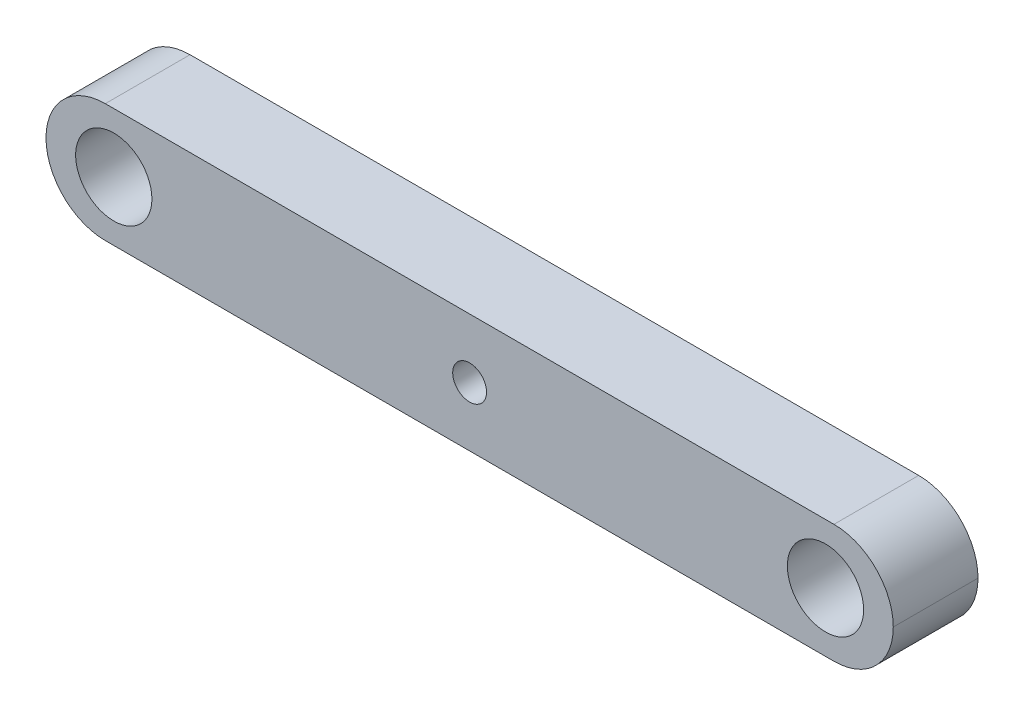
ISO-10303-21;
HEADER;
FILE_DESCRIPTION(('STEP AP214'),'2;1');
FILE_NAME('part.step','',(''),(''),'','','');
FILE_SCHEMA(('AUTOMOTIVE_DESIGN { 1 0 10303 214 1 1 1 1 }'));
ENDSEC;
DATA;
#1=APPLICATION_CONTEXT('core data for automotive mechanical design processes');
#2=APPLICATION_PROTOCOL_DEFINITION('international standard','automotive_design',2000,#1);
#3=PRODUCT_CONTEXT('',#1,'mechanical');
#4=PRODUCT('Part','Part','',(#3));
#5=PRODUCT_RELATED_PRODUCT_CATEGORY('part','',(#4));
#6=PRODUCT_DEFINITION_FORMATION('','',#4);
#7=PRODUCT_DEFINITION_CONTEXT('part definition',#1,'design');
#8=PRODUCT_DEFINITION('design','',#6,#7);
#9=PRODUCT_DEFINITION_SHAPE('','',#8);
#10=(LENGTH_UNIT() NAMED_UNIT(*) SI_UNIT(.MILLI.,.METRE.));
#11=(NAMED_UNIT(*) PLANE_ANGLE_UNIT() SI_UNIT($,.RADIAN.));
#12=(NAMED_UNIT(*) SI_UNIT($,.STERADIAN.) SOLID_ANGLE_UNIT());
#13=UNCERTAINTY_MEASURE_WITH_UNIT(LENGTH_MEASURE(1.E-05),#10,'distance_accuracy_value','');
#14=(GEOMETRIC_REPRESENTATION_CONTEXT(3) GLOBAL_UNCERTAINTY_ASSIGNED_CONTEXT((#13)) GLOBAL_UNIT_ASSIGNED_CONTEXT((#10,
#11,#12)) REPRESENTATION_CONTEXT('',''));
#15=CARTESIAN_POINT('',(0.,0.,0.));
#16=DIRECTION('',(0.,0.,1.));
#17=DIRECTION('',(1.,0.,0.));
#18=AXIS2_PLACEMENT_3D('',#15,#16,#17);
#19=CARTESIAN_POINT('',(0.,0.,5.));
#20=DIRECTION('',(0.,0.,-1.));
#21=DIRECTION('',(-1.,0.,0.));
#22=AXIS2_PLACEMENT_3D('',#19,#20,#21);
#23=PLANE('',#22);
#24=DIRECTION('',(1.,0.,0.));
#25=VECTOR('',#24,1.);
#26=CARTESIAN_POINT('',(0.,0.,5.));
#27=LINE('',#26,#25);
#28=CARTESIAN_POINT('',(3.5,0.,5.));
#29=VERTEX_POINT('',#28);
#30=CARTESIAN_POINT('',(46.5,0.,5.));
#31=VERTEX_POINT('',#30);
#32=EDGE_CURVE('E157',#29,#31,#27,.T.);
#33=ORIENTED_EDGE('',*,*,#32,.T.);
#34=CARTESIAN_POINT('',(46.5,3.5,5.));
#35=DIRECTION('',(0.,0.,-1.));
#36=DIRECTION('',(-1.,0.,0.));
#37=AXIS2_PLACEMENT_3D('',#34,#35,#36);
#38=CIRCLE('',#37,3.5);
#39=CARTESIAN_POINT('',(50.,3.5,5.));
#40=VERTEX_POINT('',#39);
#41=EDGE_CURVE('E132',#31,#40,#38,.F.);
#42=ORIENTED_EDGE('',*,*,#41,.T.);
#43=CARTESIAN_POINT('',(46.5,3.5,5.));
#44=DIRECTION('',(0.,0.,-1.));
#45=DIRECTION('',(-1.,0.,0.));
#46=AXIS2_PLACEMENT_3D('',#43,#44,#45);
#47=CIRCLE('',#46,3.5);
#48=CARTESIAN_POINT('',(46.5,7.,5.));
#49=VERTEX_POINT('',#48);
#50=EDGE_CURVE('E63',#40,#49,#47,.F.);
#51=ORIENTED_EDGE('',*,*,#50,.T.);
#52=DIRECTION('',(-1.,0.,0.));
#53=VECTOR('',#52,1.);
#54=CARTESIAN_POINT('',(0.,7.,5.));
#55=LINE('',#54,#53);
#56=CARTESIAN_POINT('',(3.5,7.,5.));
#57=VERTEX_POINT('',#56);
#58=EDGE_CURVE('E113',#49,#57,#55,.T.);
#59=ORIENTED_EDGE('',*,*,#58,.T.);
#60=CARTESIAN_POINT('',(3.5,3.5,5.));
#61=DIRECTION('',(0.,0.,-1.));
#62=DIRECTION('',(-1.,0.,0.));
#63=AXIS2_PLACEMENT_3D('',#60,#61,#62);
#64=CIRCLE('',#63,3.5);
#65=CARTESIAN_POINT('',(0.,3.5,5.));
#66=VERTEX_POINT('',#65);
#67=EDGE_CURVE('E139',#57,#66,#64,.F.);
#68=ORIENTED_EDGE('',*,*,#67,.T.);
#69=CARTESIAN_POINT('',(3.5,3.5,5.));
#70=DIRECTION('',(0.,0.,-1.));
#71=DIRECTION('',(-1.,0.,0.));
#72=AXIS2_PLACEMENT_3D('',#69,#70,#71);
#73=CIRCLE('',#72,3.5);
#74=EDGE_CURVE('E116',#66,#29,#73,.F.);
#75=ORIENTED_EDGE('',*,*,#74,.T.);
#76=EDGE_LOOP('',(#33,#42,#51,#59,#68,#75));
#77=FACE_BOUND('',#76,.T.);
#78=CARTESIAN_POINT('',(24.9999999999999,3.5,5.));
#79=DIRECTION('',(0.,0.,1.));
#80=DIRECTION('',(1.,0.,0.));
#81=AXIS2_PLACEMENT_3D('',#78,#79,#80);
#82=CIRCLE('',#81,1.);
#83=CARTESIAN_POINT('',(25.9999999999999,3.5,5.));
#84=VERTEX_POINT('',#83);
#85=EDGE_CURVE('E160',#84,#84,#82,.T.);
#86=ORIENTED_EDGE('',*,*,#85,.F.);
#87=EDGE_LOOP('',(#86));
#88=FACE_BOUND('',#87,.T.);
#89=CARTESIAN_POINT('',(46.,3.5,5.));
#90=DIRECTION('',(0.,0.,1.));
#91=DIRECTION('',(1.,0.,0.));
#92=AXIS2_PLACEMENT_3D('',#89,#90,#91);
#93=CIRCLE('',#92,2.25);
#94=CARTESIAN_POINT('',(48.25,3.5,5.));
#95=VERTEX_POINT('',#94);
#96=EDGE_CURVE('E170',#95,#95,#93,.T.);
#97=ORIENTED_EDGE('',*,*,#96,.F.);
#98=EDGE_LOOP('',(#97));
#99=FACE_BOUND('',#98,.T.);
#100=CARTESIAN_POINT('',(4.,3.5,5.));
#101=DIRECTION('',(0.,0.,1.));
#102=DIRECTION('',(1.,0.,0.));
#103=AXIS2_PLACEMENT_3D('',#100,#101,#102);
#104=CIRCLE('',#103,2.25);
#105=CARTESIAN_POINT('',(6.25,3.5,5.));
#106=VERTEX_POINT('',#105);
#107=EDGE_CURVE('E127',#106,#106,#104,.T.);
#108=ORIENTED_EDGE('',*,*,#107,.F.);
#109=EDGE_LOOP('',(#108));
#110=FACE_BOUND('',#109,.T.);
#111=ADVANCED_FACE('F39',(#77,#88,#99,#110),#23,.F.);
#112=CARTESIAN_POINT('',(0.,0.,0.));
#113=DIRECTION('',(0.,0.,-1.));
#114=DIRECTION('',(-1.,0.,0.));
#115=AXIS2_PLACEMENT_3D('',#112,#113,#114);
#116=PLANE('',#115);
#117=CARTESIAN_POINT('',(46.,3.5,0.));
#118=DIRECTION('',(0.,0.,1.));
#119=DIRECTION('',(1.,0.,0.));
#120=AXIS2_PLACEMENT_3D('',#117,#118,#119);
#121=CIRCLE('',#120,2.25);
#122=CARTESIAN_POINT('',(48.25,3.5,0.));
#123=VERTEX_POINT('',#122);
#124=EDGE_CURVE('E174',#123,#123,#121,.T.);
#125=ORIENTED_EDGE('',*,*,#124,.T.);
#126=EDGE_LOOP('',(#125));
#127=FACE_BOUND('',#126,.T.);
#128=CARTESIAN_POINT('',(46.5,3.5,0.));
#129=DIRECTION('',(0.,0.,-1.));
#130=DIRECTION('',(-1.,0.,0.));
#131=AXIS2_PLACEMENT_3D('',#128,#129,#130);
#132=CIRCLE('',#131,3.5);
#133=CARTESIAN_POINT('',(46.5,7.,0.));
#134=VERTEX_POINT('',#133);
#135=CARTESIAN_POINT('',(50.,3.5,0.));
#136=VERTEX_POINT('',#135);
#137=EDGE_CURVE('E106',#134,#136,#132,.T.);
#138=ORIENTED_EDGE('',*,*,#137,.T.);
#139=CARTESIAN_POINT('',(46.5,3.5,0.));
#140=DIRECTION('',(0.,0.,-1.));
#141=DIRECTION('',(-1.,0.,0.));
#142=AXIS2_PLACEMENT_3D('',#139,#140,#141);
#143=CIRCLE('',#142,3.5);
#144=CARTESIAN_POINT('',(46.5,0.,0.));
#145=VERTEX_POINT('',#144);
#146=EDGE_CURVE('E149',#136,#145,#143,.T.);
#147=ORIENTED_EDGE('',*,*,#146,.T.);
#148=DIRECTION('',(1.,0.,0.));
#149=VECTOR('',#148,1.);
#150=CARTESIAN_POINT('',(0.,0.,0.));
#151=LINE('',#150,#149);
#152=CARTESIAN_POINT('',(3.5,0.,0.));
#153=VERTEX_POINT('',#152);
#154=EDGE_CURVE('E100',#153,#145,#151,.T.);
#155=ORIENTED_EDGE('',*,*,#154,.F.);
#156=CARTESIAN_POINT('',(3.5,3.5,0.));
#157=DIRECTION('',(0.,0.,-1.));
#158=DIRECTION('',(-1.,0.,0.));
#159=AXIS2_PLACEMENT_3D('',#156,#157,#158);
#160=CIRCLE('',#159,3.5);
#161=CARTESIAN_POINT('',(0.,3.5,0.));
#162=VERTEX_POINT('',#161);
#163=EDGE_CURVE('E93',#153,#162,#160,.T.);
#164=ORIENTED_EDGE('',*,*,#163,.T.);
#165=CARTESIAN_POINT('',(3.5,3.5,0.));
#166=DIRECTION('',(0.,0.,-1.));
#167=DIRECTION('',(-1.,0.,0.));
#168=AXIS2_PLACEMENT_3D('',#165,#166,#167);
#169=CIRCLE('',#168,3.5);
#170=CARTESIAN_POINT('',(3.5,7.,0.));
#171=VERTEX_POINT('',#170);
#172=EDGE_CURVE('E98',#162,#171,#169,.T.);
#173=ORIENTED_EDGE('',*,*,#172,.T.);
#174=DIRECTION('',(-1.,0.,0.));
#175=VECTOR('',#174,1.);
#176=CARTESIAN_POINT('',(0.,7.,0.));
#177=LINE('',#176,#175);
#178=EDGE_CURVE('E154',#134,#171,#177,.T.);
#179=ORIENTED_EDGE('',*,*,#178,.F.);
#180=EDGE_LOOP('',(#138,#147,#155,#164,#173,#179));
#181=FACE_BOUND('',#180,.T.);
#182=CARTESIAN_POINT('',(24.9999999999999,3.5,0.));
#183=DIRECTION('',(0.,0.,1.));
#184=DIRECTION('',(1.,0.,0.));
#185=AXIS2_PLACEMENT_3D('',#182,#183,#184);
#186=CIRCLE('',#185,1.);
#187=CARTESIAN_POINT('',(25.9999999999999,3.5,0.));
#188=VERTEX_POINT('',#187);
#189=EDGE_CURVE('E166',#188,#188,#186,.T.);
#190=ORIENTED_EDGE('',*,*,#189,.T.);
#191=EDGE_LOOP('',(#190));
#192=FACE_BOUND('',#191,.T.);
#193=CARTESIAN_POINT('',(4.,3.5,0.));
#194=DIRECTION('',(0.,0.,1.));
#195=DIRECTION('',(1.,0.,0.));
#196=AXIS2_PLACEMENT_3D('',#193,#194,#195);
#197=CIRCLE('',#196,2.25);
#198=CARTESIAN_POINT('',(6.25,3.5,0.));
#199=VERTEX_POINT('',#198);
#200=EDGE_CURVE('E121',#199,#199,#197,.T.);
#201=ORIENTED_EDGE('',*,*,#200,.T.);
#202=EDGE_LOOP('',(#201));
#203=FACE_BOUND('',#202,.T.);
#204=ADVANCED_FACE('F95',(#127,#181,#192,#203),#116,.T.);
#205=CARTESIAN_POINT('',(0.,0.,5.));
#206=DIRECTION('',(0.,1.,0.));
#207=DIRECTION('',(0.,0.,1.));
#208=AXIS2_PLACEMENT_3D('',#205,#206,#207);
#209=PLANE('',#208);
#210=ORIENTED_EDGE('',*,*,#154,.T.);
#211=DIRECTION('',(0.,0.,-1.));
#212=VECTOR('',#211,1.);
#213=CARTESIAN_POINT('',(46.5,0.,5.));
#214=LINE('',#213,#212);
#215=EDGE_CURVE('E142',#145,#31,#214,.F.);
#216=ORIENTED_EDGE('',*,*,#215,.T.);
#217=ORIENTED_EDGE('',*,*,#32,.F.);
#218=DIRECTION('',(0.,0.,-1.));
#219=VECTOR('',#218,1.);
#220=CARTESIAN_POINT('',(3.5,0.,5.));
#221=LINE('',#220,#219);
#222=EDGE_CURVE('E146',#29,#153,#221,.T.);
#223=ORIENTED_EDGE('',*,*,#222,.T.);
#224=EDGE_LOOP('',(#210,#216,#217,#223));
#225=FACE_BOUND('',#224,.T.);
#226=ADVANCED_FACE('F193',(#225),#209,.F.);
#227=CARTESIAN_POINT('',(0.,7.,5.));
#228=DIRECTION('',(0.,-1.,0.));
#229=DIRECTION('',(0.,0.,-1.));
#230=AXIS2_PLACEMENT_3D('',#227,#228,#229);
#231=PLANE('',#230);
#232=ORIENTED_EDGE('',*,*,#58,.F.);
#233=DIRECTION('',(0.,0.,-1.));
#234=VECTOR('',#233,1.);
#235=CARTESIAN_POINT('',(46.5,7.,5.));
#236=LINE('',#235,#234);
#237=EDGE_CURVE('E11',#49,#134,#236,.T.);
#238=ORIENTED_EDGE('',*,*,#237,.T.);
#239=ORIENTED_EDGE('',*,*,#178,.T.);
#240=DIRECTION('',(0.,0.,-1.));
#241=VECTOR('',#240,1.);
#242=CARTESIAN_POINT('',(3.5,7.,5.));
#243=LINE('',#242,#241);
#244=EDGE_CURVE('E49',#171,#57,#243,.F.);
#245=ORIENTED_EDGE('',*,*,#244,.T.);
#246=EDGE_LOOP('',(#232,#238,#239,#245));
#247=FACE_BOUND('',#246,.T.);
#248=ADVANCED_FACE('F201',(#247),#231,.F.);
#249=CARTESIAN_POINT('',(24.9999999999999,3.5,5.));
#250=DIRECTION('',(0.,0.,-1.));
#251=DIRECTION('',(-1.,0.,0.));
#252=AXIS2_PLACEMENT_3D('',#249,#250,#251);
#253=CYLINDRICAL_SURFACE('',#252,1.);
#254=ORIENTED_EDGE('',*,*,#85,.T.);
#255=EDGE_LOOP('',(#254));
#256=FACE_BOUND('',#255,.T.);
#257=ORIENTED_EDGE('',*,*,#189,.F.);
#258=EDGE_LOOP('',(#257));
#259=FACE_BOUND('',#258,.T.);
#260=ADVANCED_FACE('F198',(#256,#259),#253,.F.);
#261=CARTESIAN_POINT('',(46.,3.5,5.));
#262=DIRECTION('',(0.,0.,-1.));
#263=DIRECTION('',(-1.,0.,0.));
#264=AXIS2_PLACEMENT_3D('',#261,#262,#263);
#265=CYLINDRICAL_SURFACE('',#264,2.25);
#266=ORIENTED_EDGE('',*,*,#96,.T.);
#267=EDGE_LOOP('',(#266));
#268=FACE_BOUND('',#267,.T.);
#269=ORIENTED_EDGE('',*,*,#124,.F.);
#270=EDGE_LOOP('',(#269));
#271=FACE_BOUND('',#270,.T.);
#272=ADVANCED_FACE('F234',(#268,#271),#265,.F.);
#273=CARTESIAN_POINT('',(4.,3.5,5.));
#274=DIRECTION('',(0.,0.,-1.));
#275=DIRECTION('',(-1.,0.,0.));
#276=AXIS2_PLACEMENT_3D('',#273,#274,#275);
#277=CYLINDRICAL_SURFACE('',#276,2.25);
#278=ORIENTED_EDGE('',*,*,#107,.T.);
#279=EDGE_LOOP('',(#278));
#280=FACE_BOUND('',#279,.T.);
#281=ORIENTED_EDGE('',*,*,#200,.F.);
#282=EDGE_LOOP('',(#281));
#283=FACE_BOUND('',#282,.T.);
#284=ADVANCED_FACE('F185',(#280,#283),#277,.F.);
#285=CARTESIAN_POINT('',(46.5,3.5,5.));
#286=DIRECTION('',(0.,0.,-1.));
#287=DIRECTION('',(-1.,0.,0.));
#288=AXIS2_PLACEMENT_3D('',#285,#286,#287);
#289=CYLINDRICAL_SURFACE('',#288,3.5);
#290=ORIENTED_EDGE('',*,*,#237,.F.);
#291=ORIENTED_EDGE('',*,*,#50,.F.);
#292=DIRECTION('',(0.,0.,-1.));
#293=VECTOR('',#292,1.);
#294=CARTESIAN_POINT('',(50.,3.5,5.));
#295=LINE('',#294,#293);
#296=EDGE_CURVE('E118',#136,#40,#295,.F.);
#297=ORIENTED_EDGE('',*,*,#296,.F.);
#298=ORIENTED_EDGE('',*,*,#137,.F.);
#299=EDGE_LOOP('',(#290,#291,#297,#298));
#300=FACE_BOUND('',#299,.T.);
#301=ADVANCED_FACE('F210',(#300),#289,.T.);
#302=CARTESIAN_POINT('',(46.5,3.5,5.));
#303=DIRECTION('',(0.,0.,-1.));
#304=DIRECTION('',(-1.,0.,0.));
#305=AXIS2_PLACEMENT_3D('',#302,#303,#304);
#306=CYLINDRICAL_SURFACE('',#305,3.5);
#307=ORIENTED_EDGE('',*,*,#41,.F.);
#308=ORIENTED_EDGE('',*,*,#215,.F.);
#309=ORIENTED_EDGE('',*,*,#146,.F.);
#310=ORIENTED_EDGE('',*,*,#296,.T.);
#311=EDGE_LOOP('',(#307,#308,#309,#310));
#312=FACE_BOUND('',#311,.T.);
#313=ADVANCED_FACE('F207',(#312),#306,.T.);
#314=CARTESIAN_POINT('',(3.5,3.5,5.));
#315=DIRECTION('',(0.,0.,-1.));
#316=DIRECTION('',(-1.,0.,0.));
#317=AXIS2_PLACEMENT_3D('',#314,#315,#316);
#318=CYLINDRICAL_SURFACE('',#317,3.5);
#319=DIRECTION('',(0.,0.,-1.));
#320=VECTOR('',#319,1.);
#321=CARTESIAN_POINT('',(0.,3.5,5.));
#322=LINE('',#321,#320);
#323=EDGE_CURVE('E43',#66,#162,#322,.T.);
#324=ORIENTED_EDGE('',*,*,#323,.F.);
#325=ORIENTED_EDGE('',*,*,#67,.F.);
#326=ORIENTED_EDGE('',*,*,#244,.F.);
#327=ORIENTED_EDGE('',*,*,#172,.F.);
#328=EDGE_LOOP('',(#324,#325,#326,#327));
#329=FACE_BOUND('',#328,.T.);
#330=ADVANCED_FACE('F41',(#329),#318,.T.);
#331=CARTESIAN_POINT('',(3.5,3.5,5.));
#332=DIRECTION('',(0.,0.,-1.));
#333=DIRECTION('',(-1.,0.,0.));
#334=AXIS2_PLACEMENT_3D('',#331,#332,#333);
#335=CYLINDRICAL_SURFACE('',#334,3.5);
#336=ORIENTED_EDGE('',*,*,#74,.F.);
#337=ORIENTED_EDGE('',*,*,#323,.T.);
#338=ORIENTED_EDGE('',*,*,#163,.F.);
#339=ORIENTED_EDGE('',*,*,#222,.F.);
#340=EDGE_LOOP('',(#336,#337,#338,#339));
#341=FACE_BOUND('',#340,.T.);
#342=ADVANCED_FACE('F115',(#341),#335,.T.);
#343=CLOSED_SHELL('',(#111,#204,#226,#248,#260,#272,#284,#301,#313,#330,#342));
#344=MANIFOLD_SOLID_BREP('B2',#343);
#345=ADVANCED_BREP_SHAPE_REPRESENTATION('',(#18,#344),#14);
#346=SHAPE_DEFINITION_REPRESENTATION(#9,#345);
ENDSEC;
END-ISO-10303-21;
